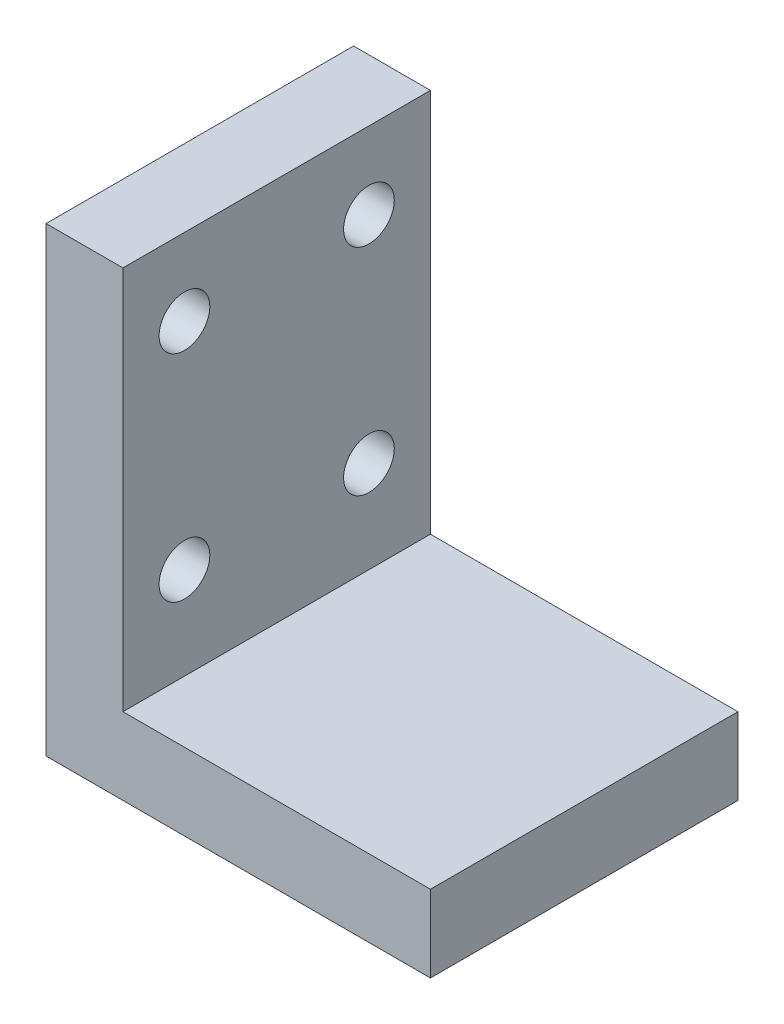
ISO-10303-21;
HEADER;
FILE_DESCRIPTION(('STEP AP214'),'2;1');
FILE_NAME('part.step','',(''),(''),'','','');
FILE_SCHEMA(('AUTOMOTIVE_DESIGN { 1 0 10303 214 1 1 1 1 }'));
ENDSEC;
DATA;
#1=APPLICATION_CONTEXT('core data for automotive mechanical design processes');
#2=APPLICATION_PROTOCOL_DEFINITION('international standard','automotive_design',2000,#1);
#3=PRODUCT_CONTEXT('',#1,'mechanical');
#4=PRODUCT('Part','Part','',(#3));
#5=PRODUCT_RELATED_PRODUCT_CATEGORY('part','',(#4));
#6=PRODUCT_DEFINITION_FORMATION('','',#4);
#7=PRODUCT_DEFINITION_CONTEXT('part definition',#1,'design');
#8=PRODUCT_DEFINITION('design','',#6,#7);
#9=PRODUCT_DEFINITION_SHAPE('','',#8);
#10=(LENGTH_UNIT() NAMED_UNIT(*) SI_UNIT(.MILLI.,.METRE.));
#11=(NAMED_UNIT(*) PLANE_ANGLE_UNIT() SI_UNIT($,.RADIAN.));
#12=(NAMED_UNIT(*) SI_UNIT($,.STERADIAN.) SOLID_ANGLE_UNIT());
#13=UNCERTAINTY_MEASURE_WITH_UNIT(LENGTH_MEASURE(1.E-05),#10,'distance_accuracy_value','');
#14=(GEOMETRIC_REPRESENTATION_CONTEXT(3) GLOBAL_UNCERTAINTY_ASSIGNED_CONTEXT((#13)) GLOBAL_UNIT_ASSIGNED_CONTEXT((#10,
#11,#12)) REPRESENTATION_CONTEXT('',''));
#15=CARTESIAN_POINT('',(0.,0.,0.));
#16=DIRECTION('',(0.,0.,1.));
#17=DIRECTION('',(1.,0.,0.));
#18=AXIS2_PLACEMENT_3D('',#15,#16,#17);
#19=CARTESIAN_POINT('',(5.,30.,20.));
#20=DIRECTION('',(0.,-1.,0.));
#21=DIRECTION('',(0.,0.,-1.));
#22=AXIS2_PLACEMENT_3D('',#19,#20,#21);
#23=PLANE('',#22);
#24=DIRECTION('',(-1.,0.,0.));
#25=VECTOR('',#24,1.);
#26=CARTESIAN_POINT('',(5.,30.,0.));
#27=LINE('',#26,#25);
#28=CARTESIAN_POINT('',(5.,30.,0.));
#29=VERTEX_POINT('',#28);
#30=CARTESIAN_POINT('',(0.,30.,0.));
#31=VERTEX_POINT('',#30);
#32=EDGE_CURVE('E123',#29,#31,#27,.T.);
#33=ORIENTED_EDGE('',*,*,#32,.T.);
#34=DIRECTION('',(0.,0.,-1.));
#35=VECTOR('',#34,1.);
#36=CARTESIAN_POINT('',(0.,30.,20.));
#37=LINE('',#36,#35);
#38=CARTESIAN_POINT('',(0.,30.,20.));
#39=VERTEX_POINT('',#38);
#40=EDGE_CURVE('E11',#39,#31,#37,.T.);
#41=ORIENTED_EDGE('',*,*,#40,.F.);
#42=DIRECTION('',(-1.,0.,0.));
#43=VECTOR('',#42,1.);
#44=CARTESIAN_POINT('',(5.,30.,20.));
#45=LINE('',#44,#43);
#46=CARTESIAN_POINT('',(5.,30.,20.));
#47=VERTEX_POINT('',#46);
#48=EDGE_CURVE('E134',#47,#39,#45,.T.);
#49=ORIENTED_EDGE('',*,*,#48,.F.);
#50=DIRECTION('',(0.,0.,-1.));
#51=VECTOR('',#50,1.);
#52=CARTESIAN_POINT('',(5.,30.,20.));
#53=LINE('',#52,#51);
#54=EDGE_CURVE('E119',#47,#29,#53,.T.);
#55=ORIENTED_EDGE('',*,*,#54,.T.);
#56=EDGE_LOOP('',(#33,#41,#49,#55));
#57=FACE_BOUND('',#56,.T.);
#58=ADVANCED_FACE('F39',(#57),#23,.F.);
#59=CARTESIAN_POINT('',(0.,30.,20.));
#60=DIRECTION('',(1.,0.,0.));
#61=DIRECTION('',(0.,1.,0.));
#62=AXIS2_PLACEMENT_3D('',#59,#60,#61);
#63=PLANE('',#62);
#64=CARTESIAN_POINT('',(0.,11.,16.));
#65=DIRECTION('',(1.,0.,0.));
#66=DIRECTION('',(0.,1.,0.));
#67=AXIS2_PLACEMENT_3D('',#64,#65,#66);
#68=CIRCLE('',#67,1.65);
#69=CARTESIAN_POINT('',(0.,12.65,16.));
#70=VERTEX_POINT('',#69);
#71=EDGE_CURVE('E127',#70,#70,#68,.T.);
#72=ORIENTED_EDGE('',*,*,#71,.T.);
#73=EDGE_LOOP('',(#72));
#74=FACE_BOUND('',#73,.T.);
#75=CARTESIAN_POINT('',(0.,11.,4.));
#76=DIRECTION('',(1.,0.,0.));
#77=DIRECTION('',(0.,1.,0.));
#78=AXIS2_PLACEMENT_3D('',#75,#76,#77);
#79=CIRCLE('',#78,1.65);
#80=CARTESIAN_POINT('',(0.,12.65,4.));
#81=VERTEX_POINT('',#80);
#82=EDGE_CURVE('E245',#81,#81,#79,.T.);
#83=ORIENTED_EDGE('',*,*,#82,.T.);
#84=EDGE_LOOP('',(#83));
#85=FACE_BOUND('',#84,.T.);
#86=CARTESIAN_POINT('',(0.,25.,4.));
#87=DIRECTION('',(1.,0.,0.));
#88=DIRECTION('',(0.,1.,0.));
#89=AXIS2_PLACEMENT_3D('',#86,#87,#88);
#90=CIRCLE('',#89,1.65);
#91=CARTESIAN_POINT('',(0.,26.65,4.));
#92=VERTEX_POINT('',#91);
#93=EDGE_CURVE('E248',#92,#92,#90,.T.);
#94=ORIENTED_EDGE('',*,*,#93,.T.);
#95=EDGE_LOOP('',(#94));
#96=FACE_BOUND('',#95,.T.);
#97=CARTESIAN_POINT('',(0.,25.,16.));
#98=DIRECTION('',(1.,0.,0.));
#99=DIRECTION('',(0.,1.,0.));
#100=AXIS2_PLACEMENT_3D('',#97,#98,#99);
#101=CIRCLE('',#100,1.65);
#102=CARTESIAN_POINT('',(0.,26.65,16.));
#103=VERTEX_POINT('',#102);
#104=EDGE_CURVE('E255',#103,#103,#101,.T.);
#105=ORIENTED_EDGE('',*,*,#104,.T.);
#106=EDGE_LOOP('',(#105));
#107=FACE_BOUND('',#106,.T.);
#108=DIRECTION('',(0.,-1.,0.));
#109=VECTOR('',#108,1.);
#110=CARTESIAN_POINT('',(0.,30.,0.));
#111=LINE('',#110,#109);
#112=CARTESIAN_POINT('',(0.,0.,0.));
#113=VERTEX_POINT('',#112);
#114=EDGE_CURVE('E126',#31,#113,#111,.T.);
#115=ORIENTED_EDGE('',*,*,#114,.T.);
#116=DIRECTION('',(0.,0.,-1.));
#117=VECTOR('',#116,1.);
#118=CARTESIAN_POINT('',(0.,0.,20.));
#119=LINE('',#118,#117);
#120=CARTESIAN_POINT('',(0.,0.,20.));
#121=VERTEX_POINT('',#120);
#122=EDGE_CURVE('E47',#121,#113,#119,.T.);
#123=ORIENTED_EDGE('',*,*,#122,.F.);
#124=DIRECTION('',(0.,-1.,0.));
#125=VECTOR('',#124,1.);
#126=CARTESIAN_POINT('',(0.,30.,20.));
#127=LINE('',#126,#125);
#128=EDGE_CURVE('E92',#39,#121,#127,.T.);
#129=ORIENTED_EDGE('',*,*,#128,.F.);
#130=ORIENTED_EDGE('',*,*,#40,.T.);
#131=EDGE_LOOP('',(#115,#123,#129,#130));
#132=FACE_BOUND('',#131,.T.);
#133=ADVANCED_FACE('F163',(#74,#85,#96,#107,#132),#63,.F.);
#134=CARTESIAN_POINT('',(0.,0.,20.));
#135=DIRECTION('',(0.,1.,0.));
#136=DIRECTION('',(0.,0.,1.));
#137=AXIS2_PLACEMENT_3D('',#134,#135,#136);
#138=PLANE('',#137);
#139=DIRECTION('',(1.,0.,0.));
#140=VECTOR('',#139,1.);
#141=CARTESIAN_POINT('',(0.,0.,0.));
#142=LINE('',#141,#140);
#143=CARTESIAN_POINT('',(25.,0.,0.));
#144=VERTEX_POINT('',#143);
#145=EDGE_CURVE('E129',#113,#144,#142,.T.);
#146=ORIENTED_EDGE('',*,*,#145,.T.);
#147=DIRECTION('',(0.,0.,-1.));
#148=VECTOR('',#147,1.);
#149=CARTESIAN_POINT('',(25.,0.,20.));
#150=LINE('',#149,#148);
#151=CARTESIAN_POINT('',(25.,0.,20.));
#152=VERTEX_POINT('',#151);
#153=EDGE_CURVE('E114',#152,#144,#150,.T.);
#154=ORIENTED_EDGE('',*,*,#153,.F.);
#155=DIRECTION('',(1.,0.,0.));
#156=VECTOR('',#155,1.);
#157=CARTESIAN_POINT('',(0.,0.,20.));
#158=LINE('',#157,#156);
#159=EDGE_CURVE('E105',#121,#152,#158,.T.);
#160=ORIENTED_EDGE('',*,*,#159,.F.);
#161=ORIENTED_EDGE('',*,*,#122,.T.);
#162=EDGE_LOOP('',(#146,#154,#160,#161));
#163=FACE_BOUND('',#162,.T.);
#164=ADVANCED_FACE('F140',(#163),#138,.F.);
#165=CARTESIAN_POINT('',(25.,0.,20.));
#166=DIRECTION('',(-1.,0.,0.));
#167=DIRECTION('',(0.,0.,1.));
#168=AXIS2_PLACEMENT_3D('',#165,#166,#167);
#169=PLANE('',#168);
#170=DIRECTION('',(0.,1.,0.));
#171=VECTOR('',#170,1.);
#172=CARTESIAN_POINT('',(25.,0.,0.));
#173=LINE('',#172,#171);
#174=CARTESIAN_POINT('',(25.,5.,0.));
#175=VERTEX_POINT('',#174);
#176=EDGE_CURVE('E113',#144,#175,#173,.T.);
#177=ORIENTED_EDGE('',*,*,#176,.T.);
#178=DIRECTION('',(0.,0.,-1.));
#179=VECTOR('',#178,1.);
#180=CARTESIAN_POINT('',(25.,5.,20.));
#181=LINE('',#180,#179);
#182=CARTESIAN_POINT('',(25.,5.,20.));
#183=VERTEX_POINT('',#182);
#184=EDGE_CURVE('E110',#183,#175,#181,.T.);
#185=ORIENTED_EDGE('',*,*,#184,.F.);
#186=DIRECTION('',(0.,1.,0.));
#187=VECTOR('',#186,1.);
#188=CARTESIAN_POINT('',(25.,0.,20.));
#189=LINE('',#188,#187);
#190=EDGE_CURVE('E99',#152,#183,#189,.T.);
#191=ORIENTED_EDGE('',*,*,#190,.F.);
#192=ORIENTED_EDGE('',*,*,#153,.T.);
#193=EDGE_LOOP('',(#177,#185,#191,#192));
#194=FACE_BOUND('',#193,.T.);
#195=ADVANCED_FACE('F111',(#194),#169,.F.);
#196=CARTESIAN_POINT('',(25.,5.,20.));
#197=DIRECTION('',(0.,-1.,0.));
#198=DIRECTION('',(1.,0.,0.));
#199=AXIS2_PLACEMENT_3D('',#196,#197,#198);
#200=PLANE('',#199);
#201=DIRECTION('',(-1.,0.,0.));
#202=VECTOR('',#201,1.);
#203=CARTESIAN_POINT('',(25.,5.,0.));
#204=LINE('',#203,#202);
#205=CARTESIAN_POINT('',(5.,5.,0.));
#206=VERTEX_POINT('',#205);
#207=EDGE_CURVE('E78',#175,#206,#204,.T.);
#208=ORIENTED_EDGE('',*,*,#207,.T.);
#209=DIRECTION('',(0.,0.,-1.));
#210=VECTOR('',#209,1.);
#211=CARTESIAN_POINT('',(5.,5.,20.));
#212=LINE('',#211,#210);
#213=CARTESIAN_POINT('',(5.,5.,20.));
#214=VERTEX_POINT('',#213);
#215=EDGE_CURVE('E115',#214,#206,#212,.T.);
#216=ORIENTED_EDGE('',*,*,#215,.F.);
#217=DIRECTION('',(-1.,0.,0.));
#218=VECTOR('',#217,1.);
#219=CARTESIAN_POINT('',(25.,5.,20.));
#220=LINE('',#219,#218);
#221=EDGE_CURVE('E103',#183,#214,#220,.T.);
#222=ORIENTED_EDGE('',*,*,#221,.F.);
#223=ORIENTED_EDGE('',*,*,#184,.T.);
#224=EDGE_LOOP('',(#208,#216,#222,#223));
#225=FACE_BOUND('',#224,.T.);
#226=ADVANCED_FACE('F117',(#225),#200,.F.);
#227=CARTESIAN_POINT('',(5.,5.,20.));
#228=DIRECTION('',(-1.,0.,0.));
#229=DIRECTION('',(0.,0.,1.));
#230=AXIS2_PLACEMENT_3D('',#227,#228,#229);
#231=PLANE('',#230);
#232=CARTESIAN_POINT('',(5.,11.,16.));
#233=DIRECTION('',(1.,0.,0.));
#234=DIRECTION('',(0.,0.,-1.));
#235=AXIS2_PLACEMENT_3D('',#232,#233,#234);
#236=CIRCLE('',#235,1.65);
#237=CARTESIAN_POINT('',(5.,11.,14.35));
#238=VERTEX_POINT('',#237);
#239=EDGE_CURVE('E243',#238,#238,#236,.T.);
#240=ORIENTED_EDGE('',*,*,#239,.F.);
#241=EDGE_LOOP('',(#240));
#242=FACE_BOUND('',#241,.T.);
#243=CARTESIAN_POINT('',(5.,11.,4.));
#244=DIRECTION('',(1.,0.,0.));
#245=DIRECTION('',(0.,0.,-1.));
#246=AXIS2_PLACEMENT_3D('',#243,#244,#245);
#247=CIRCLE('',#246,1.65);
#248=CARTESIAN_POINT('',(5.,11.,2.35));
#249=VERTEX_POINT('',#248);
#250=EDGE_CURVE('E263',#249,#249,#247,.T.);
#251=ORIENTED_EDGE('',*,*,#250,.F.);
#252=EDGE_LOOP('',(#251));
#253=FACE_BOUND('',#252,.T.);
#254=CARTESIAN_POINT('',(5.,25.,4.));
#255=DIRECTION('',(1.,0.,0.));
#256=DIRECTION('',(0.,0.,-1.));
#257=AXIS2_PLACEMENT_3D('',#254,#255,#256);
#258=CIRCLE('',#257,1.65);
#259=CARTESIAN_POINT('',(5.,25.,2.35));
#260=VERTEX_POINT('',#259);
#261=EDGE_CURVE('E261',#260,#260,#258,.T.);
#262=ORIENTED_EDGE('',*,*,#261,.F.);
#263=EDGE_LOOP('',(#262));
#264=FACE_BOUND('',#263,.T.);
#265=CARTESIAN_POINT('',(5.,25.,16.));
#266=DIRECTION('',(1.,0.,0.));
#267=DIRECTION('',(0.,0.,-1.));
#268=AXIS2_PLACEMENT_3D('',#265,#266,#267);
#269=CIRCLE('',#268,1.65);
#270=CARTESIAN_POINT('',(5.,25.,14.35));
#271=VERTEX_POINT('',#270);
#272=EDGE_CURVE('E258',#271,#271,#269,.T.);
#273=ORIENTED_EDGE('',*,*,#272,.F.);
#274=EDGE_LOOP('',(#273));
#275=FACE_BOUND('',#274,.T.);
#276=DIRECTION('',(0.,1.,0.));
#277=VECTOR('',#276,1.);
#278=CARTESIAN_POINT('',(5.,5.,0.));
#279=LINE('',#278,#277);
#280=EDGE_CURVE('E84',#206,#29,#279,.T.);
#281=ORIENTED_EDGE('',*,*,#280,.T.);
#282=ORIENTED_EDGE('',*,*,#54,.F.);
#283=DIRECTION('',(0.,1.,0.));
#284=VECTOR('',#283,1.);
#285=CARTESIAN_POINT('',(5.,5.,20.));
#286=LINE('',#285,#284);
#287=EDGE_CURVE('E55',#214,#47,#286,.T.);
#288=ORIENTED_EDGE('',*,*,#287,.F.);
#289=ORIENTED_EDGE('',*,*,#215,.T.);
#290=EDGE_LOOP('',(#281,#282,#288,#289));
#291=FACE_BOUND('',#290,.T.);
#292=ADVANCED_FACE('F147',(#242,#253,#264,#275,#291),#231,.F.);
#293=CARTESIAN_POINT('',(0.,0.,20.));
#294=DIRECTION('',(0.,0.,1.));
#295=DIRECTION('',(1.,0.,0.));
#296=AXIS2_PLACEMENT_3D('',#293,#294,#295);
#297=PLANE('',#296);
#298=ORIENTED_EDGE('',*,*,#48,.T.);
#299=ORIENTED_EDGE('',*,*,#128,.T.);
#300=ORIENTED_EDGE('',*,*,#159,.T.);
#301=ORIENTED_EDGE('',*,*,#190,.T.);
#302=ORIENTED_EDGE('',*,*,#221,.T.);
#303=ORIENTED_EDGE('',*,*,#287,.T.);
#304=EDGE_LOOP('',(#298,#299,#300,#301,#302,#303));
#305=FACE_BOUND('',#304,.T.);
#306=ADVANCED_FACE('F101',(#305),#297,.T.);
#307=CARTESIAN_POINT('',(0.,0.,0.));
#308=DIRECTION('',(0.,0.,1.));
#309=DIRECTION('',(1.,0.,0.));
#310=AXIS2_PLACEMENT_3D('',#307,#308,#309);
#311=PLANE('',#310);
#312=ORIENTED_EDGE('',*,*,#32,.F.);
#313=ORIENTED_EDGE('',*,*,#280,.F.);
#314=ORIENTED_EDGE('',*,*,#207,.F.);
#315=ORIENTED_EDGE('',*,*,#176,.F.);
#316=ORIENTED_EDGE('',*,*,#145,.F.);
#317=ORIENTED_EDGE('',*,*,#114,.F.);
#318=EDGE_LOOP('',(#312,#313,#314,#315,#316,#317));
#319=FACE_BOUND('',#318,.T.);
#320=ADVANCED_FACE('F143',(#319),#311,.F.);
#321=CARTESIAN_POINT('',(-15.,25.,16.));
#322=DIRECTION('',(1.,0.,0.));
#323=DIRECTION('',(0.,0.,-1.));
#324=AXIS2_PLACEMENT_3D('',#321,#322,#323);
#325=CYLINDRICAL_SURFACE('',#324,1.65);
#326=ORIENTED_EDGE('',*,*,#272,.T.);
#327=EDGE_LOOP('',(#326));
#328=FACE_BOUND('',#327,.T.);
#329=ORIENTED_EDGE('',*,*,#104,.F.);
#330=EDGE_LOOP('',(#329));
#331=FACE_BOUND('',#330,.T.);
#332=ADVANCED_FACE('F197',(#328,#331),#325,.F.);
#333=CARTESIAN_POINT('',(-15.,25.,4.));
#334=DIRECTION('',(1.,0.,0.));
#335=DIRECTION('',(0.,0.,-1.));
#336=AXIS2_PLACEMENT_3D('',#333,#334,#335);
#337=CYLINDRICAL_SURFACE('',#336,1.65);
#338=ORIENTED_EDGE('',*,*,#261,.T.);
#339=EDGE_LOOP('',(#338));
#340=FACE_BOUND('',#339,.T.);
#341=ORIENTED_EDGE('',*,*,#93,.F.);
#342=EDGE_LOOP('',(#341));
#343=FACE_BOUND('',#342,.T.);
#344=ADVANCED_FACE('F202',(#340,#343),#337,.F.);
#345=CARTESIAN_POINT('',(-15.,11.,4.));
#346=DIRECTION('',(1.,0.,0.));
#347=DIRECTION('',(0.,0.,-1.));
#348=AXIS2_PLACEMENT_3D('',#345,#346,#347);
#349=CYLINDRICAL_SURFACE('',#348,1.65);
#350=ORIENTED_EDGE('',*,*,#250,.T.);
#351=EDGE_LOOP('',(#350));
#352=FACE_BOUND('',#351,.T.);
#353=ORIENTED_EDGE('',*,*,#82,.F.);
#354=EDGE_LOOP('',(#353));
#355=FACE_BOUND('',#354,.T.);
#356=ADVANCED_FACE('F210',(#352,#355),#349,.F.);
#357=CARTESIAN_POINT('',(-15.,11.,16.));
#358=DIRECTION('',(1.,0.,0.));
#359=DIRECTION('',(0.,0.,-1.));
#360=AXIS2_PLACEMENT_3D('',#357,#358,#359);
#361=CYLINDRICAL_SURFACE('',#360,1.65);
#362=ORIENTED_EDGE('',*,*,#239,.T.);
#363=EDGE_LOOP('',(#362));
#364=FACE_BOUND('',#363,.T.);
#365=ORIENTED_EDGE('',*,*,#71,.F.);
#366=EDGE_LOOP('',(#365));
#367=FACE_BOUND('',#366,.T.);
#368=ADVANCED_FACE('F218',(#364,#367),#361,.F.);
#369=CLOSED_SHELL('',(#58,#133,#164,#195,#226,#292,#306,#320,#332,#344,#356,#368));
#370=MANIFOLD_SOLID_BREP('B2',#369);
#371=ADVANCED_BREP_SHAPE_REPRESENTATION('',(#18,#370),#14);
#372=SHAPE_DEFINITION_REPRESENTATION(#9,#371);
ENDSEC;
END-ISO-10303-21;
